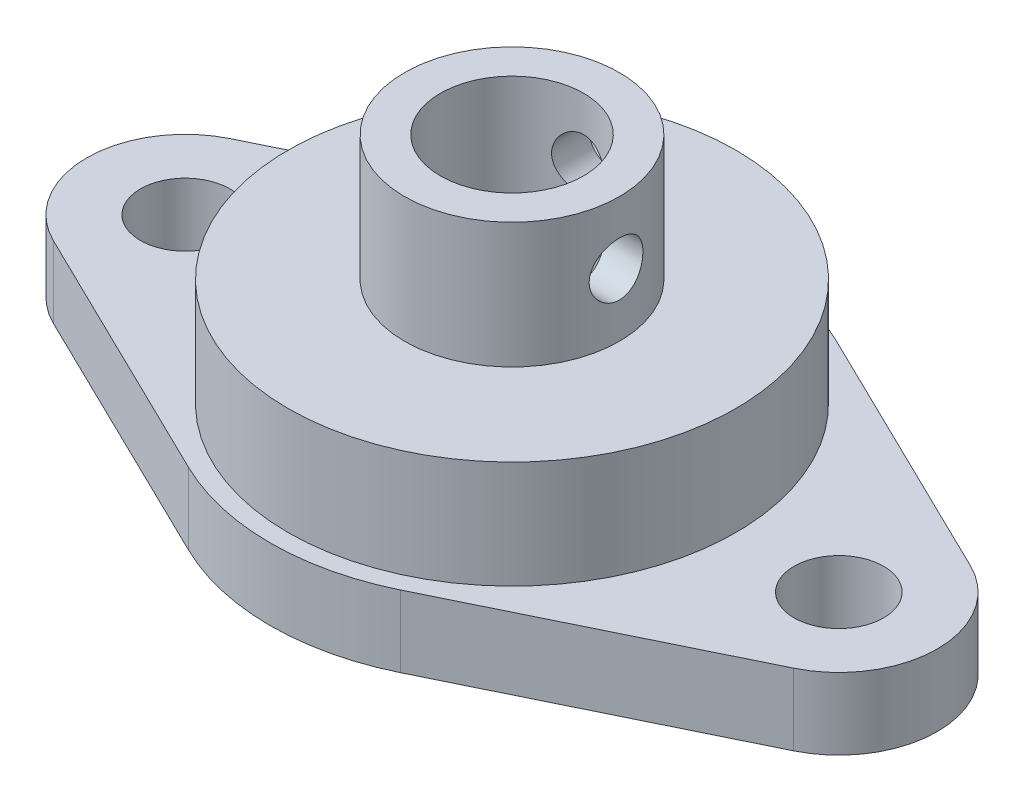
ISO-10303-21;
HEADER;
FILE_DESCRIPTION(('STEP AP214'),'2;1');
FILE_NAME('part.step','',(''),(''),'','','');
FILE_SCHEMA(('AUTOMOTIVE_DESIGN { 1 0 10303 214 1 1 1 1 }'));
ENDSEC;
DATA;
#1=APPLICATION_CONTEXT('core data for automotive mechanical design processes');
#2=APPLICATION_PROTOCOL_DEFINITION('international standard','automotive_design',2000,#1);
#3=PRODUCT_CONTEXT('',#1,'mechanical');
#4=PRODUCT('Part','Part','',(#3));
#5=PRODUCT_RELATED_PRODUCT_CATEGORY('part','',(#4));
#6=PRODUCT_DEFINITION_FORMATION('','',#4);
#7=PRODUCT_DEFINITION_CONTEXT('part definition',#1,'design');
#8=PRODUCT_DEFINITION('design','',#6,#7);
#9=PRODUCT_DEFINITION_SHAPE('','',#8);
#10=(LENGTH_UNIT() NAMED_UNIT(*) SI_UNIT(.MILLI.,.METRE.));
#11=(NAMED_UNIT(*) PLANE_ANGLE_UNIT() SI_UNIT($,.RADIAN.));
#12=(NAMED_UNIT(*) SI_UNIT($,.STERADIAN.) SOLID_ANGLE_UNIT());
#13=UNCERTAINTY_MEASURE_WITH_UNIT(LENGTH_MEASURE(1.E-05),#10,'distance_accuracy_value','');
#14=(GEOMETRIC_REPRESENTATION_CONTEXT(3) GLOBAL_UNCERTAINTY_ASSIGNED_CONTEXT((#13)) GLOBAL_UNIT_ASSIGNED_CONTEXT((#10,
#11,#12)) REPRESENTATION_CONTEXT('',''));
#15=CARTESIAN_POINT('',(0.,0.,0.));
#16=DIRECTION('',(0.,0.,1.));
#17=DIRECTION('',(1.,0.,0.));
#18=AXIS2_PLACEMENT_3D('',#15,#16,#17);
#19=CARTESIAN_POINT('',(0.,4.,0.));
#20=DIRECTION('',(0.,-1.,0.));
#21=DIRECTION('',(0.,0.,-1.));
#22=AXIS2_PLACEMENT_3D('',#19,#20,#21);
#23=CYLINDRICAL_SURFACE('',#22,4.);
#24=CARTESIAN_POINT('',(0.,17.,0.));
#25=DIRECTION('',(0.,1.,0.));
#26=DIRECTION('',(0.,0.,1.));
#27=AXIS2_PLACEMENT_3D('',#24,#25,#26);
#28=CIRCLE('',#27,4.);
#29=CARTESIAN_POINT('',(0.,17.,4.));
#30=VERTEX_POINT('',#29);
#31=EDGE_CURVE('E197',#30,#30,#28,.T.);
#32=ORIENTED_EDGE('',*,*,#31,.T.);
#33=EDGE_LOOP('',(#32));
#34=FACE_BOUND('',#33,.T.);
#35=CARTESIAN_POINT('',(0.,0.,0.));
#36=DIRECTION('',(0.,1.,0.));
#37=DIRECTION('',(0.,0.,1.));
#38=AXIS2_PLACEMENT_3D('',#35,#36,#37);
#39=CIRCLE('',#38,4.);
#40=CARTESIAN_POINT('',(0.,0.,4.));
#41=VERTEX_POINT('',#40);
#42=EDGE_CURVE('E147',#41,#41,#39,.T.);
#43=ORIENTED_EDGE('',*,*,#42,.F.);
#44=EDGE_LOOP('',(#43));
#45=FACE_BOUND('',#44,.T.);
#46=CARTESIAN_POINT('',(0.,15.,-4.));
#47=CARTESIAN_POINT('',(-0.0812350589378529,15.0000029023031,-4.00000217456151));
#48=CARTESIAN_POINT('',(-0.162450241781792,14.9933802397516,-3.99750379283184));
#49=CARTESIAN_POINT('',(-0.322453452352361,14.9671718047301,-3.98778696006928));
#50=CARTESIAN_POINT('',(-0.401241827987616,14.9475878995294,-3.98056918893993));
#51=CARTESIAN_POINT('',(-0.554060784990879,14.8962469982282,-3.96218832391545));
#52=CARTESIAN_POINT('',(-0.628100224162278,14.8645134831782,-3.9510328434944));
#53=CARTESIAN_POINT('',(-0.769799310160254,14.7898935869842,-3.92588767765353));
#54=CARTESIAN_POINT('',(-0.837457239177879,14.7470042144558,-3.91189723227548));
#55=CARTESIAN_POINT('',(-0.967346417045825,14.6493874689291,-3.88186246971217));
#56=CARTESIAN_POINT('',(-1.02927073015119,14.5942697377406,-3.86576002583566));
#57=CARTESIAN_POINT('',(-1.14324421474363,14.4745895653412,-3.83360220871327));
#58=CARTESIAN_POINT('',(-1.19529036359203,14.4100242439121,-3.81754685135033));
#59=CARTESIAN_POINT('',(-1.28998202215985,14.2702825324768,-3.78662470617731));
#60=CARTESIAN_POINT('',(-1.3321939319576,14.1947956334542,-3.77182648820818));
#61=CARTESIAN_POINT('',(-1.40318646334084,14.0371516458315,-3.74599860237433));
#62=CARTESIAN_POINT('',(-1.43197244961239,13.9549972368449,-3.73496742975881));
#63=CARTESIAN_POINT('',(-1.47408431017549,13.7898832597418,-3.71854412824136));
#64=CARTESIAN_POINT('',(-1.48799593218558,13.7070949615646,-3.71293924350838));
#65=CARTESIAN_POINT('',(-1.50179556531648,13.5401838420062,-3.70738061461215));
#66=CARTESIAN_POINT('',(-1.5016893680263,13.4560615861255,-3.70742453659305));
#67=CARTESIAN_POINT('',(-1.48790429610018,13.294230474787,-3.71297511632055));
#68=CARTESIAN_POINT('',(-1.47503808509003,13.2164390939558,-3.71815468871122));
#69=CARTESIAN_POINT('',(-1.4374416786833,13.0642128495947,-3.73284938059529));
#70=CARTESIAN_POINT('',(-1.41270969663258,12.9897784933861,-3.74236515298863));
#71=CARTESIAN_POINT('',(-1.35163748571904,12.8447229322718,-3.76485702190253));
#72=CARTESIAN_POINT('',(-1.31508648737101,12.7742005138787,-3.77789517988166));
#73=CARTESIAN_POINT('',(-1.23156073762698,12.640054262409,-3.80594210139319));
#74=CARTESIAN_POINT('',(-1.18458238728897,12.5764328224803,-3.82095154457158));
#75=CARTESIAN_POINT('',(-1.07781780766549,12.4533963363491,-3.85248038859113));
#76=CARTESIAN_POINT('',(-1.01738298716956,12.3945513592519,-3.86903347455671));
#77=CARTESIAN_POINT('',(-0.887312590819021,12.2876620337942,-3.90091728164085));
#78=CARTESIAN_POINT('',(-0.817675603497365,12.2396193453943,-3.91624781465952));
#79=CARTESIAN_POINT('',(-0.66972343699242,12.1550696029375,-3.9442639480908));
#80=CARTESIAN_POINT('',(-0.591290713844719,12.1187524187789,-3.95690498259616));
#81=CARTESIAN_POINT('',(-0.428836850524583,12.06001739573,-3.97778718326962));
#82=CARTESIAN_POINT('',(-0.344818210845767,12.0375933834389,-3.98603030341493));
#83=CARTESIAN_POINT('',(-0.178375243148665,12.0083772124581,-3.99684443228065));
#84=CARTESIAN_POINT('',(-0.0961036195622094,12.0008173936175,-3.99969369025686));
#85=CARTESIAN_POINT('',(0.0685724752550241,11.9993089361001,-4.00025893700126));
#86=CARTESIAN_POINT('',(0.150976912983372,12.0053572796832,-3.99797606386863));
#87=CARTESIAN_POINT('',(0.310262048561859,12.0303100423087,-3.98871709772643));
#88=CARTESIAN_POINT('',(0.387233328007335,12.0487115437371,-3.98192470962305));
#89=CARTESIAN_POINT('',(0.53694175495722,12.0971860725473,-3.96451477091717));
#90=CARTESIAN_POINT('',(0.609678350347534,12.127260617948,-3.9538967228203));
#91=CARTESIAN_POINT('',(0.751247765110155,12.1991864124395,-3.92949624407681));
#92=CARTESIAN_POINT('',(0.819903083557795,12.2413577292234,-3.91563000209348));
#93=CARTESIAN_POINT('',(0.949392711726625,12.3359181031716,-3.88626671564664));
#94=CARTESIAN_POINT('',(1.01022412027045,12.3883109325452,-3.87076907009516));
#95=CARTESIAN_POINT('',(1.12603079874454,12.5054041221243,-3.8387332949099));
#96=CARTESIAN_POINT('',(1.18046154123568,12.5706421827727,-3.82218696503729));
#97=CARTESIAN_POINT('',(1.27771050031903,12.7096513847077,-3.79078815746854));
#98=CARTESIAN_POINT('',(1.32052767414518,12.7834232913885,-3.77593583194399));
#99=CARTESIAN_POINT('',(1.39337773518998,12.9380159867723,-3.74966829822463));
#100=CARTESIAN_POINT('',(1.42335685446918,13.0188647459104,-3.73826760328493));
#101=CARTESIAN_POINT('',(1.46907883466889,13.1850097636878,-3.72054032891005));
#102=CARTESIAN_POINT('',(1.48483050305535,13.2703032361981,-3.71421061057491));
#103=CARTESIAN_POINT('',(1.50086347097839,13.4370161595411,-3.70775894792573));
#104=CARTESIAN_POINT('',(1.50207331495837,13.5183326317169,-3.70726444523341));
#105=CARTESIAN_POINT('',(1.49136715641593,13.6799453162762,-3.71158412745292));
#106=CARTESIAN_POINT('',(1.47945239850124,13.7602416246716,-3.71639780898899));
#107=CARTESIAN_POINT('',(1.44355815630242,13.9150472267166,-3.73048141585432));
#108=CARTESIAN_POINT('',(1.41995798316524,13.9896583462453,-3.73961085376663));
#109=CARTESIAN_POINT('',(1.3616969677992,14.1339055084944,-3.76121548297845));
#110=CARTESIAN_POINT('',(1.32703332944945,14.2035402880701,-3.77369151995215));
#111=CARTESIAN_POINT('',(1.24552075938154,14.3398267896976,-3.80139723903965));
#112=CARTESIAN_POINT('',(1.1981283280301,14.4061307967999,-3.81673698440964));
#113=CARTESIAN_POINT('',(1.09334485729906,14.5301415609712,-3.84806246757177));
#114=CARTESIAN_POINT('',(1.03595064012808,14.5878455747868,-3.86404840943145));
#115=CARTESIAN_POINT('',(0.909080396784623,14.6962019558218,-3.89590424609881));
#116=CARTESIAN_POINT('',(0.839118644212992,14.7463037534347,-3.91172104900645));
#117=CARTESIAN_POINT('',(0.691213223200821,14.8340226552766,-3.94054514457031));
#118=CARTESIAN_POINT('',(0.613268934090622,14.8716387877364,-3.95355221851559));
#119=CARTESIAN_POINT('',(0.447999082002312,14.9343768290483,-3.9757429260668));
#120=CARTESIAN_POINT('',(0.360413422234208,14.9588870646019,-3.98473657158356));
#121=CARTESIAN_POINT('',(0.181875733606382,14.9916929599207,-3.99686242179587));
#122=CARTESIAN_POINT('',(0.090925416364859,14.9999967514873,-3.99999756603967));
#123=CARTESIAN_POINT('',(0.,15.,-4.));
#124=B_SPLINE_CURVE_WITH_KNOTS('',3,(#46,#47,#48,#49,#50,#51,#52,#53,#54,#55,#56,#57,#58,#59,
#60,#61,#62,#63,#64,#65,#66,#67,#68,#69,#70,#71,#72,#73,#74,#75,#76,#77,#78,#79,#80,#81,#82,#83,
#84,#85,#86,#87,#88,#89,#90,#91,#92,#93,#94,#95,#96,#97,#98,#99,#100,#101,#102,#103,#104,#105,
#106,#107,#108,#109,#110,#111,#112,#113,#114,#115,#116,#117,#118,#119,#120,#121,#122,#123),
.UNSPECIFIED.,.T.,.F.,(4,2,2,2,2,2,2,2,2,2,2,2,2,2,2,2,2,2,2,2,2,2,2,2,2,2,2,2,2,2,2,2,2,2,2,2,
2,2,4),(0.,0.24336980156056,0.48670454953046,0.729571369213573,0.972503379609489,
1.22473618582716,1.47704604925622,1.73896674501659,2.00078269352134,2.25185874416901,
2.50283106079707,2.73878345119971,2.97477138060589,3.21522408387018,3.45575990744258,
3.71246153335813,3.96920257905066,4.22991375286075,4.49050899698846,4.73725019635925,
4.9839366839052,5.2211443792384,5.45838293254453,5.70259221859599,5.94689180019868,
6.20536519455657,6.46386178920141,6.72343066727204,6.98283874956507,7.22558763480252,
7.46831350211259,7.70363142426533,7.93900886656506,8.18672471884271,8.43451941997062,
8.69572329654039,8.95694749805102,9.22948515032042,9.50188601796127),.UNSPECIFIED.);
#125=CARTESIAN_POINT('',(0.,15.,-4.));
#126=VERTEX_POINT('',#125);
#127=EDGE_CURVE('E175',#126,#126,#124,.T.);
#128=ORIENTED_EDGE('',*,*,#127,.F.);
#129=EDGE_LOOP('',(#128));
#130=FACE_BOUND('',#129,.T.);
#131=CARTESIAN_POINT('',(3.70809924354783,13.5,1.5));
#132=CARTESIAN_POINT('',(3.70809640633806,13.4189925162792,1.50000304106109));
#133=CARTESIAN_POINT('',(3.71078260240986,13.3380050774964,1.49341597549487));
#134=CARTESIAN_POINT('',(3.72116159304967,13.1784719170868,1.46736187895468));
#135=CARTESIAN_POINT('',(3.72885423767112,13.099926122405,1.44789523373263));
#136=CARTESIAN_POINT('',(3.748254802809,12.9476246283865,1.39689657610574));
#137=CARTESIAN_POINT('',(3.7599530956926,12.8738579433489,1.36539347266349));
#138=CARTESIAN_POINT('',(3.78603134206598,12.7326281031812,1.29131856742698));
#139=CARTESIAN_POINT('',(3.80041210067323,12.6651668497175,1.24874344095039));
#140=CARTESIAN_POINT('',(3.83103574665713,12.5351096883772,1.15146661374162));
#141=CARTESIAN_POINT('',(3.84733341923603,12.4728714703706,1.09630381213307));
#142=CARTESIAN_POINT('',(3.87949750628547,12.3582771853285,0.976395839778928));
#143=CARTESIAN_POINT('',(3.89536382814785,12.3059232262581,0.911648630256681));
#144=CARTESIAN_POINT('',(3.92552873936553,12.2108604877044,0.771694655177601));
#145=CARTESIAN_POINT('',(3.93975561223505,12.1685405252841,0.696206947538029));
#146=CARTESIAN_POINT('',(3.96438007973847,12.0973488274751,0.538555771965249));
#147=CARTESIAN_POINT('',(3.97477900217006,12.068472428008,0.456394630933538));
#148=CARTESIAN_POINT('',(3.9901869710344,12.0262421042254,0.291489341676834));
#149=CARTESIAN_POINT('',(3.99540915214774,12.0122723725595,0.208923197281599));
#150=CARTESIAN_POINT('',(4.0006401410794,11.998278799055,0.0424643637947882));
#151=CARTESIAN_POINT('',(4.00065064414902,11.9982504223813,-0.0414278850628309));
#152=CARTESIAN_POINT('',(3.99559265903894,12.0117817614652,-0.203743543064474));
#153=CARTESIAN_POINT('',(3.99077541996683,12.0246692979488,-0.282232178266898));
#154=CARTESIAN_POINT('',(3.97693274932263,12.0625359152256,-0.435839217984389));
#155=CARTESIAN_POINT('',(3.96790701975578,12.087515852262,-0.510957383430296));
#156=CARTESIAN_POINT('',(3.94637769167531,12.1491704516758,-0.656989017303102));
#157=CARTESIAN_POINT('',(3.93382539470077,12.1860100052684,-0.727825392287307));
#158=CARTESIAN_POINT('',(3.90651310225279,12.2701920969294,-0.862486607957557));
#159=CARTESIAN_POINT('',(3.8917523951284,12.3175380230176,-0.926309176932321));
#160=CARTESIAN_POINT('',(3.86052529655816,12.4246272862832,-1.04909048680093));
#161=CARTESIAN_POINT('',(3.84400963763883,12.4849339156504,-1.10754614526348));
#162=CARTESIAN_POINT('',(3.81182460645722,12.6145929933216,-1.21370395569342));
#163=CARTESIAN_POINT('',(3.79615544748847,12.6839477065866,-1.261403406929));
#164=CARTESIAN_POINT('',(3.76712703500335,12.8317194674628,-1.34565611808151));
#165=CARTESIAN_POINT('',(3.75382677150277,12.9103034936861,-1.38193847851831));
#166=CARTESIAN_POINT('',(3.73172438629003,13.0730962251676,-1.44056464441501));
#167=CARTESIAN_POINT('',(3.72291976205783,13.1573017715937,-1.46291620605595));
#168=CARTESIAN_POINT('',(3.71139597222848,13.323975962316,-1.49190191709668));
#169=CARTESIAN_POINT('',(3.70836785241537,13.4062841055361,-1.49933521158966));
#170=CARTESIAN_POINT('',(3.70786539525016,13.5710093567417,-1.50057885636272));
#171=CARTESIAN_POINT('',(3.71038967003987,13.6534264323525,-1.49439261093762));
#172=CARTESIAN_POINT('',(3.72039381629735,13.8119299222877,-1.46929733520157));
#173=CARTESIAN_POINT('',(3.72763276216449,13.8881311357647,-1.45100618334224));
#174=CARTESIAN_POINT('',(3.74596487046362,14.0363479447202,-1.40299774640637));
#175=CARTESIAN_POINT('',(3.75705882250173,14.1083626791681,-1.37327812034623));
#176=CARTESIAN_POINT('',(3.7823624311608,14.2491644380762,-1.30200292275278));
#177=CARTESIAN_POINT('',(3.79667328892065,14.3177292921373,-1.26004545177047));
#178=CARTESIAN_POINT('',(3.82662814294291,14.447128981726,-1.16591317862479));
#179=CARTESIAN_POINT('',(3.84227262594077,14.5079609746246,-1.11373463696434));
#180=CARTESIAN_POINT('',(3.87433046553184,14.6241683731951,-0.996727340900936));
#181=CARTESIAN_POINT('',(3.89072969357028,14.6789534087688,-0.93130634149106));
#182=CARTESIAN_POINT('',(3.92149874963302,14.7768383675894,-0.791797471753149));
#183=CARTESIAN_POINT('',(3.93586857107664,14.8199382529458,-0.717709573322671));
#184=CARTESIAN_POINT('',(3.96094985704552,14.8929460561996,-0.563016329468475));
#185=CARTESIAN_POINT('',(3.9716738133801,14.9228991237926,-0.482434433064625));
#186=CARTESIAN_POINT('',(3.98829436712571,14.9686564138499,-0.316881887523253));
#187=CARTESIAN_POINT('',(3.99419323299413,14.9844672854224,-0.231913320723591));
#188=CARTESIAN_POINT('',(4.00028407317073,15.0007744027548,-0.0653355852738141));
#189=CARTESIAN_POINT('',(4.00078860953764,15.002109483059,0.0161807680608466));
#190=CARTESIAN_POINT('',(3.99684889809223,14.9915848405546,0.178226786412425));
#191=CARTESIAN_POINT('',(3.9924052471313,14.9797267091141,0.258756569245258));
#192=CARTESIAN_POINT('',(3.97921089603771,14.9437411485064,0.414548248377127));
#193=CARTESIAN_POINT('',(3.97056791378017,14.9199200941216,0.489890731068835));
#194=CARTESIAN_POINT('',(3.9498778362099,14.8609899866156,0.635515473006391));
#195=CARTESIAN_POINT('',(3.93783009655664,14.8258787966952,0.705796771275544));
#196=CARTESIAN_POINT('',(3.91090618300074,14.7436860564952,0.842540176994414));
#197=CARTESIAN_POINT('',(3.89593240108828,14.6961633594859,0.90871754884685));
#198=CARTESIAN_POINT('',(3.86499507694844,14.5911921698124,1.03241734752336));
#199=CARTESIAN_POINT('',(3.84903118274027,14.5337401341921,1.0899366712559));
#200=CARTESIAN_POINT('',(3.81688129739175,14.4069358683549,1.19781214236196));
#201=CARTESIAN_POINT('',(3.8007280534916,14.3371155978457,1.24762999816025));
#202=CARTESIAN_POINT('',(3.77098325003638,14.1895841304267,1.33484709556843));
#203=CARTESIAN_POINT('',(3.75739195631216,14.1118721159465,1.37224504878157));
#204=CARTESIAN_POINT('',(3.73402269853266,13.9470443190246,1.4346588697426));
#205=CARTESIAN_POINT('',(3.7244380329086,13.8596656334882,1.45906002899523));
#206=CARTESIAN_POINT('',(3.71147994336315,13.6815147280442,1.49172356722079));
#207=CARTESIAN_POINT('',(3.70810242179736,13.59074478729,1.49999659339571));
#208=CARTESIAN_POINT('',(3.70809924354783,13.5,1.5));
#209=B_SPLINE_CURVE_WITH_KNOTS('',3,(#131,#132,#133,#134,#135,#136,#137,#138,#139,#140,#141,
#142,#143,#144,#145,#146,#147,#148,#149,#150,#151,#152,#153,#154,#155,#156,#157,#158,#159,#160,
#161,#162,#163,#164,#165,#166,#167,#168,#169,#170,#171,#172,#173,#174,#175,#176,#177,#178,#179,
#180,#181,#182,#183,#184,#185,#186,#187,#188,#189,#190,#191,#192,#193,#194,#195,#196,#197,#198,
#199,#200,#201,#202,#203,#204,#205,#206,#207,#208),.UNSPECIFIED.,.T.,.F.,(4,2,2,2,2,2,2,2,2,2,2,
2,2,2,2,2,2,2,2,2,2,2,2,2,2,2,2,2,2,2,2,2,2,2,2,2,2,2,4),(0.,0.242684541416169,
0.485361814598854,0.72745985675703,0.969630679682932,1.22274652401128,1.47591628822983,
1.73770072136421,1.9993942638133,2.24980018489679,2.50012465404857,2.73806472803194,
2.97602165263335,3.21744131210668,3.45893893628976,3.71456675065874,3.97025867827335,
4.23162592252966,4.49284751635474,4.73965657740485,4.98640395388884,5.22143845928198,
5.45652113429526,5.70041561005822,5.94439948466355,6.20385016993624,6.46330169650178,
6.72185508890168,6.98028685560127,7.22365720549936,7.4669982031948,7.7044027400389,
7.94185223512831,8.18928323676987,8.43680270894964,8.69738599542079,8.95799630544242,
9.23003178870926,9.50188762323053),.UNSPECIFIED.);
#210=CARTESIAN_POINT('',(3.70809924354783,13.5,1.5));
#211=VERTEX_POINT('',#210);
#212=EDGE_CURVE('E176',#211,#211,#209,.T.);
#213=ORIENTED_EDGE('',*,*,#212,.T.);
#214=EDGE_LOOP('',(#213));
#215=FACE_BOUND('',#214,.T.);
#216=ADVANCED_FACE('F38',(#34,#45,#130,#215),#23,.F.);
#217=CARTESIAN_POINT('',(0.,17.,0.));
#218=DIRECTION('',(0.,-1.,0.));
#219=DIRECTION('',(0.,0.,-1.));
#220=AXIS2_PLACEMENT_3D('',#217,#218,#219);
#221=CYLINDRICAL_SURFACE('',#220,6.);
#222=CARTESIAN_POINT('',(0.,15.,-6.));
#223=CARTESIAN_POINT('',(-0.0828760886697309,14.9999976742618,-5.99999859868013));
#224=CARTESIAN_POINT('',(-0.165778157830763,14.9931084492262,-5.99826578131828));
#225=CARTESIAN_POINT('',(-0.329206323770532,14.965774848693,-5.99152113829892));
#226=CARTESIAN_POINT('',(-0.409731046870739,14.9453227904622,-5.98650745419968));
#227=CARTESIAN_POINT('',(-0.566020872182577,14.8915607465379,-5.9737562633204));
#228=CARTESIAN_POINT('',(-0.641791563430003,14.8582662012847,-5.96602202842087));
#229=CARTESIAN_POINT('',(-0.786672131904426,14.7798186099552,-5.94865343807593));
#230=CARTESIAN_POINT('',(-0.855781784348759,14.7346651638811,-5.9390190185405));
#231=CARTESIAN_POINT('',(-0.986801927300919,14.6327992103458,-5.91867413591801));
#232=CARTESIAN_POINT('',(-1.04855569006107,14.5758884250408,-5.90794707148533));
#233=CARTESIAN_POINT('',(-1.1617489272033,14.4525477950911,-5.8867362011753));
#234=CARTESIAN_POINT('',(-1.21318723694913,14.3861168770535,-5.87625242288348));
#235=CARTESIAN_POINT('',(-1.30502654279903,14.2444047732626,-5.8565477569971));
#236=CARTESIAN_POINT('',(-1.34525221592536,14.1690067691896,-5.84734794470605));
#237=CARTESIAN_POINT('',(-1.41239690855053,14.0122515883416,-5.83149494812223));
#238=CARTESIAN_POINT('',(-1.43931805543933,13.9308953666742,-5.82484135672789));
#239=CARTESIAN_POINT('',(-1.47855483680429,13.7662565017975,-5.81500476717551));
#240=CARTESIAN_POINT('',(-1.49115226833334,13.6830451039502,-5.81175491075426));
#241=CARTESIAN_POINT('',(-1.50226177506785,13.515631430986,-5.80889362537741));
#242=CARTESIAN_POINT('',(-1.50077614181798,13.4314293193014,-5.80928160448644));
#243=CARTESIAN_POINT('',(-1.48398652463928,13.2665841922555,-5.81359205496618));
#244=CARTESIAN_POINT('',(-1.46901834019052,13.1859043785349,-5.81742863001879));
#245=CARTESIAN_POINT('',(-1.42622418690311,13.0282389490887,-5.82806709676484));
#246=CARTESIAN_POINT('',(-1.39839730206942,12.951253596971,-5.83486919970696));
#247=CARTESIAN_POINT('',(-1.33038947793716,12.8022619837479,-5.85075113904187));
#248=CARTESIAN_POINT('',(-1.29008666723291,12.7303138282104,-5.85985327469421));
#249=CARTESIAN_POINT('',(-1.19835627601496,12.5940812902432,-5.87929710846386));
#250=CARTESIAN_POINT('',(-1.14692674880884,12.5297982519327,-5.88963902334735));
#251=CARTESIAN_POINT('',(-1.03266342468122,12.4087963843056,-5.91075880539781));
#252=CARTESIAN_POINT('',(-0.969546258165859,12.3523455099386,-5.92154069477971));
#253=CARTESIAN_POINT('',(-0.8346119175037,12.2507787575361,-5.94205965578786));
#254=CARTESIAN_POINT('',(-0.762794477707944,12.2056632257364,-5.95179669549415));
#255=CARTESIAN_POINT('',(-0.612115888681392,12.1279494137756,-5.96917732094183));
#256=CARTESIAN_POINT('',(-0.533231393208624,12.0953946597456,-5.97681360127725));
#257=CARTESIAN_POINT('',(-0.370876008142883,12.0440826942904,-5.98907916991419));
#258=CARTESIAN_POINT('',(-0.287405999150485,12.0253228435819,-5.99370903339281));
#259=CARTESIAN_POINT('',(-0.120539970390027,12.0025424344412,-5.99935499271375));
#260=CARTESIAN_POINT('',(-0.0371967199882098,11.9981569739247,-6.00046053508279));
#261=CARTESIAN_POINT('',(0.129032874801508,12.0032490020555,-5.99918804814451));
#262=CARTESIAN_POINT('',(0.211919259644595,12.0127252427991,-5.99681033241847));
#263=CARTESIAN_POINT('',(0.373614268776491,12.0449709083914,-5.98889581127357));
#264=CARTESIAN_POINT('',(0.452465118968754,12.067541263477,-5.98340634185811));
#265=CARTESIAN_POINT('',(0.605257292452511,12.1251070840284,-5.96988706634134));
#266=CARTESIAN_POINT('',(0.679198119032634,12.1601038043132,-5.96185700369892));
#267=CARTESIAN_POINT('',(0.821523134429847,12.2422361288747,-5.94393307926311));
#268=CARTESIAN_POINT('',(0.88978544183583,12.2895761123968,-5.93400867366932));
#269=CARTESIAN_POINT('',(1.01752661364325,12.394789908797,-5.91344509187419));
#270=CARTESIAN_POINT('',(1.07700395897301,12.4526655396169,-5.90280579251705));
#271=CARTESIAN_POINT('',(1.18699056807273,12.5790019608445,-5.88168956960771));
#272=CARTESIAN_POINT('',(1.23724386762203,12.6476877030024,-5.87122304187281));
#273=CARTESIAN_POINT('',(1.3255107590127,12.7927326344657,-5.85192878377239));
#274=CARTESIAN_POINT('',(1.36352489415794,12.8690914829598,-5.84310098067026));
#275=CARTESIAN_POINT('',(1.42595142060929,13.0269057224131,-5.82818094734665));
#276=CARTESIAN_POINT('',(1.45044439665406,13.108327628344,-5.82207255291906));
#277=CARTESIAN_POINT('',(1.48534565995378,13.2743096378891,-5.81326744090184));
#278=CARTESIAN_POINT('',(1.49575702747866,13.3588690510325,-5.81056997719936));
#279=CARTESIAN_POINT('',(1.50203859033399,13.5261210238552,-5.80894901203957));
#280=CARTESIAN_POINT('',(1.49831789778012,13.6087974351247,-5.80991932728264));
#281=CARTESIAN_POINT('',(1.47737727831287,13.772303888668,-5.81527909007843));
#282=CARTESIAN_POINT('',(1.46015762268677,13.8531339680136,-5.81966846891857));
#283=CARTESIAN_POINT('',(1.41293131944279,14.0102084590654,-5.83131260682723));
#284=CARTESIAN_POINT('',(1.38300140468038,14.0864773052402,-5.83855015236309));
#285=CARTESIAN_POINT('',(1.31126491360507,14.2329653827137,-5.85507755724829));
#286=CARTESIAN_POINT('',(1.26945669003419,14.3031837731869,-5.86436770120773));
#287=CARTESIAN_POINT('',(1.17386774863714,14.437554629002,-5.88425634263512));
#288=CARTESIAN_POINT('',(1.11980316291226,14.501501073424,-5.89488264831757));
#289=CARTESIAN_POINT('',(1.00178937118974,14.6195470447954,-5.91608027246286));
#290=CARTESIAN_POINT('',(0.937837821261146,14.673644230113,-5.9266515772706));
#291=CARTESIAN_POINT('',(0.80046758670259,14.7714113085646,-5.94677655647663));
#292=CARTESIAN_POINT('',(0.726898422316387,14.8148746136716,-5.95630833365868));
#293=CARTESIAN_POINT('',(0.573266059510476,14.8887474629405,-5.97304924975118));
#294=CARTESIAN_POINT('',(0.49320756343674,14.9191663606485,-5.98026005199781));
#295=CARTESIAN_POINT('',(0.344410253243473,14.9615718303297,-5.99048059565542));
#296=CARTESIAN_POINT('',(0.27638017090807,14.9759512430534,-5.99402585052691));
#297=CARTESIAN_POINT('',(0.138906071536284,14.9951659436219,-5.99878605231948));
#298=CARTESIAN_POINT('',(0.0694621612426167,15.0000019493053,-6.00000117450894));
#299=CARTESIAN_POINT('',(0.,15.,-6.));
#300=B_SPLINE_CURVE_WITH_KNOTS('',3,(#222,#223,#224,#225,#226,#227,#228,#229,#230,#231,#232,
#233,#234,#235,#236,#237,#238,#239,#240,#241,#242,#243,#244,#245,#246,#247,#248,#249,#250,#251,
#252,#253,#254,#255,#256,#257,#258,#259,#260,#261,#262,#263,#264,#265,#266,#267,#268,#269,#270,
#271,#272,#273,#274,#275,#276,#277,#278,#279,#280,#281,#282,#283,#284,#285,#286,#287,#288,#289,
#290,#291,#292,#293,#294,#295,#296,#297,#298,#299),.UNSPECIFIED.,.T.,.F.,(4,2,2,2,2,2,2,2,2,2,2,
2,2,2,2,2,2,2,2,2,2,2,2,2,2,2,2,2,2,2,2,2,2,2,2,2,2,2,4),(0.,0.248373712471889,
0.496888237763899,0.745104902286106,0.993329940169327,1.24614435437139,1.49898729580062,
1.75558647545807,2.01214461169368,2.2635629509943,2.51494038112697,2.76022497007018,
3.00552703466038,3.25330527873879,3.50112690836163,3.75601500969019,4.01091089558247,
4.26668229009114,4.52240473688643,4.77158308949276,5.02073901112743,5.26620274514037,
5.5116912732229,5.76153587565352,6.01142363008019,6.26744509204476,6.52345518749508,
6.77792254614036,7.03233423252407,7.27943780398612,7.52653640956034,7.77216400559447,
8.01782568136901,8.2698957640991,8.52202569770417,8.77872185499588,9.0352336382135,
9.24342242942149,9.45159556043039),.UNSPECIFIED.);
#301=CARTESIAN_POINT('',(0.,15.,-6.));
#302=VERTEX_POINT('',#301);
#303=EDGE_CURVE('E169',#302,#302,#300,.T.);
#304=ORIENTED_EDGE('',*,*,#303,.T.);
#305=EDGE_LOOP('',(#304));
#306=FACE_BOUND('',#305,.T.);
#307=CARTESIAN_POINT('',(0.,17.,0.));
#308=DIRECTION('',(0.,1.,0.));
#309=DIRECTION('',(0.,0.,1.));
#310=AXIS2_PLACEMENT_3D('',#307,#308,#309);
#311=CIRCLE('',#310,6.);
#312=CARTESIAN_POINT('',(0.,17.,6.));
#313=VERTEX_POINT('',#312);
#314=EDGE_CURVE('E277',#313,#313,#311,.T.);
#315=ORIENTED_EDGE('',*,*,#314,.F.);
#316=EDGE_LOOP('',(#315));
#317=FACE_BOUND('',#316,.T.);
#318=CARTESIAN_POINT('',(0.,10.,0.));
#319=DIRECTION('',(0.,1.,0.));
#320=DIRECTION('',(0.,0.,1.));
#321=AXIS2_PLACEMENT_3D('',#318,#319,#320);
#322=CIRCLE('',#321,6.);
#323=CARTESIAN_POINT('',(0.,10.,6.));
#324=VERTEX_POINT('',#323);
#325=EDGE_CURVE('E280',#324,#324,#322,.T.);
#326=ORIENTED_EDGE('',*,*,#325,.T.);
#327=EDGE_LOOP('',(#326));
#328=FACE_BOUND('',#327,.T.);
#329=CARTESIAN_POINT('',(5.80947501931113,13.5,1.5));
#330=CARTESIAN_POINT('',(5.80947660051185,13.4171695494452,1.49999764715507));
#331=CARTESIAN_POINT('',(5.81126583608348,13.3343130607932,1.49311574729838));
#332=CARTESIAN_POINT('',(5.81821117195949,13.1709794530956,1.46581387527849));
#333=CARTESIAN_POINT('',(5.82336923173088,13.090503747319,1.44538602404532));
#334=CARTESIAN_POINT('',(5.8364323475758,12.9343178770878,1.39169471977917));
#335=CARTESIAN_POINT('',(5.84433385614245,12.8586017067686,1.35844783671268));
#336=CARTESIAN_POINT('',(5.86198915217285,12.713813488476,1.28011268475685));
#337=CARTESIAN_POINT('',(5.87174301827101,12.6447417227519,1.23502391313642));
#338=CARTESIAN_POINT('',(5.89224429813367,12.5136830128427,1.13322505638713));
#339=CARTESIAN_POINT('',(5.90300758573818,12.45186383979,1.07630213262243));
#340=CARTESIAN_POINT('',(5.92417725309178,12.3385431633838,0.952909238460401));
#341=CARTESIAN_POINT('',(5.93458359939834,12.287042624627,0.886438376508187));
#342=CARTESIAN_POINT('',(5.95404249312349,12.1951347194212,0.744687120647377));
#343=CARTESIAN_POINT('',(5.96307412440355,12.1548921671031,0.669296745717076));
#344=CARTESIAN_POINT('',(5.9785848715559,12.0877142135081,0.512557910575661));
#345=CARTESIAN_POINT('',(5.98506436400607,12.0607768488507,0.431210331475168));
#346=CARTESIAN_POINT('',(5.99462855308908,12.0215112992529,0.266615255252501));
#347=CARTESIAN_POINT('',(5.99777936306589,12.0088982134041,0.18343963172939));
#348=CARTESIAN_POINT('',(6.00056156464379,11.9977449724347,0.0160972915576659));
#349=CARTESIAN_POINT('',(6.00019347658022,11.9992027366742,-0.0680692767228369));
#350=CARTESIAN_POINT('',(5.99602856972121,12.0159449101501,-0.233028370758577));
#351=CARTESIAN_POINT('',(5.99230801404524,12.0309217950323,-0.313854323401596));
#352=CARTESIAN_POINT('',(5.98194501914912,12.0737827620291,-0.471807371120525));
#353=CARTESIAN_POINT('',(5.97530242439065,12.1016675312264,-0.548934269055653));
#354=CARTESIAN_POINT('',(5.95972505820537,12.1698015424122,-0.698110055252706));
#355=CARTESIAN_POINT('',(5.95077011817032,12.210160226797,-0.770106764649752));
#356=CARTESIAN_POINT('',(5.9315394228579,12.3020134074698,-0.906413433510729));
#357=CARTESIAN_POINT('',(5.92126343791494,12.3535098411364,-0.970722052628254));
#358=CARTESIAN_POINT('',(5.90018228261712,12.4678252451894,-1.09166105262743));
#359=CARTESIAN_POINT('',(5.88937031715551,12.5309129354087,-1.14803651861279));
#360=CARTESIAN_POINT('',(5.86869026110024,12.6657599841241,-1.24946456394452));
#361=CARTESIAN_POINT('',(5.85882221463583,12.7375197476946,-1.29451661406902));
#362=CARTESIAN_POINT('',(5.84112298098989,12.8881740204894,-1.37218219353389));
#363=CARTESIAN_POINT('',(5.83330190235433,12.9671014381879,-1.40473435045573));
#364=CARTESIAN_POINT('',(5.82071184083974,13.1295512808459,-1.45602843095451));
#365=CARTESIAN_POINT('',(5.81594220486131,13.2130727183899,-1.47477330982936));
#366=CARTESIAN_POINT('',(5.81013213623485,13.3799757009139,-1.4974977831991));
#367=CARTESIAN_POINT('',(5.80899653456189,13.4633026759978,-1.50185428435177));
#368=CARTESIAN_POINT('',(5.81032406088624,13.6294931619469,-1.49671019430933));
#369=CARTESIAN_POINT('',(5.8127868576076,13.7123567147707,-1.48721087870928));
#370=CARTESIAN_POINT('',(5.82094249172736,13.8738685589728,-1.45495527836259));
#371=CARTESIAN_POINT('',(5.82658182140625,13.9525636359425,-1.43241844096904));
#372=CARTESIAN_POINT('',(5.84040430962578,14.105058874711,-1.37497084900237));
#373=CARTESIAN_POINT('',(5.84858776949168,14.1788584554332,-1.34005862862752));
#374=CARTESIAN_POINT('',(5.86677682255958,14.3210647667204,-1.25806240076193));
#375=CARTESIAN_POINT('',(5.87681501163985,14.3893373040259,-1.21075305230138));
#376=CARTESIAN_POINT('',(5.8975024984303,14.5171130176808,-1.10559043940168));
#377=CARTESIAN_POINT('',(5.90815189637082,14.57661474999,-1.04773544220816));
#378=CARTESIAN_POINT('',(5.92918441818964,14.6866866255426,-0.921394081477087));
#379=CARTESIAN_POINT('',(5.93955421237101,14.7369960375293,-0.852677928797387));
#380=CARTESIAN_POINT('',(5.95858329968241,14.8253615201707,-0.707554024042011));
#381=CARTESIAN_POINT('',(5.96724268202376,14.8634182299649,-0.631146673436384));
#382=CARTESIAN_POINT('',(5.98182069442989,14.9258676207168,-0.473337302596633));
#383=CARTESIAN_POINT('',(5.98775898013446,14.9503585706274,-0.39197607154182));
#384=CARTESIAN_POINT('',(5.99631176037473,14.985276200765,-0.22612464047821));
#385=CARTESIAN_POINT('',(5.99892689636045,14.9957055952434,-0.141635047561864));
#386=CARTESIAN_POINT('',(6.00051254113217,15.0020513843633,0.0256252896649906));
#387=CARTESIAN_POINT('',(5.99957968320012,14.9983525636431,0.108380740449051));
#388=CARTESIAN_POINT('',(5.99438844686135,14.9774282590585,0.27205124462211));
#389=CARTESIAN_POINT('',(5.99013016735643,14.9602031774803,0.352966352671331));
#390=CARTESIAN_POINT('',(5.97878149280944,14.9129216703436,0.510256553467225));
#391=CARTESIAN_POINT('',(5.97170646753999,14.8829348200281,0.586653741871529));
#392=CARTESIAN_POINT('',(5.95546933370076,14.811044131471,0.733375579562204));
#393=CARTESIAN_POINT('',(5.94630696206604,14.7691387909957,0.803699461897578));
#394=CARTESIAN_POINT('',(5.92660874521999,14.6734271490044,0.938102892635851));
#395=CARTESIAN_POINT('',(5.91604525418417,14.6193597856389,1.00199248245088));
#396=CARTESIAN_POINT('',(5.89485973579863,14.5013657220393,1.11992253040688));
#397=CARTESIAN_POINT('',(5.88423769428834,14.4374365258531,1.17396048760229));
#398=CARTESIAN_POINT('',(5.86391213790822,14.300097878698,1.27164303971884));
#399=CARTESIAN_POINT('',(5.85422945594827,14.2265338148811,1.31507492916983));
#400=CARTESIAN_POINT('',(5.83715933325924,14.0729167651159,1.3888903449235));
#401=CARTESIAN_POINT('',(5.82977022370054,13.9928685508399,1.41928336463958));
#402=CARTESIAN_POINT('',(5.81927863109675,13.8441344822599,1.46163379284816));
#403=CARTESIAN_POINT('',(5.8156299450082,13.7761602534242,1.47598975589307));
#404=CARTESIAN_POINT('',(5.81072757878358,13.6387966965001,1.49517343885991));
#405=CARTESIAN_POINT('',(5.80947369434945,13.5694074896324,1.50000197155828));
#406=CARTESIAN_POINT('',(5.80947501931113,13.5,1.5));
#407=B_SPLINE_CURVE_WITH_KNOTS('',3,(#329,#330,#331,#332,#333,#334,#335,#336,#337,#338,#339,
#340,#341,#342,#343,#344,#345,#346,#347,#348,#349,#350,#351,#352,#353,#354,#355,#356,#357,#358,
#359,#360,#361,#362,#363,#364,#365,#366,#367,#368,#369,#370,#371,#372,#373,#374,#375,#376,#377,
#378,#379,#380,#381,#382,#383,#384,#385,#386,#387,#388,#389,#390,#391,#392,#393,#394,#395,#396,
#397,#398,#399,#400,#401,#402,#403,#404,#405,#406),.UNSPECIFIED.,.T.,.F.,(4,2,2,2,2,2,2,2,2,2,2,
2,2,2,2,2,2,2,2,2,2,2,2,2,2,2,2,2,2,2,2,2,2,2,2,2,2,2,4),(0.,0.24823646504168,0.496617444857199,
0.744678436299613,0.992749960532872,1.24574372515786,1.4987611288792,1.75530897838752,
2.01181895908255,2.26313250597208,2.51440889199612,2.76010957613368,3.00582334034871,
3.25375724552666,3.50173431281348,3.75642279943147,4.01112318719881,4.26705859205041,
4.52293920077728,4.7720614485703,5.02116076310281,5.26618443005524,5.5112371285285,
5.76109707515494,6.01099811331027,6.26715198579191,6.52329249431732,6.77755243684157,
7.03176329345423,7.27910067676474,7.52643070426188,7.77242925935826,8.01845883442843,
8.27038257949242,8.52237018939305,8.77905886370806,9.03556032819972,9.24358696306398,
9.45159585059712),.UNSPECIFIED.);
#408=CARTESIAN_POINT('',(5.80947501931113,13.5,1.5));
#409=VERTEX_POINT('',#408);
#410=EDGE_CURVE('E42',#409,#409,#407,.T.);
#411=ORIENTED_EDGE('',*,*,#410,.F.);
#412=EDGE_LOOP('',(#411));
#413=FACE_BOUND('',#412,.T.);
#414=ADVANCED_FACE('F177',(#306,#317,#328,#413),#221,.T.);
#415=CARTESIAN_POINT('',(0.,10.,0.));
#416=DIRECTION('',(0.,1.,0.));
#417=DIRECTION('',(0.,0.,1.));
#418=AXIS2_PLACEMENT_3D('',#415,#416,#417);
#419=PLANE('',#418);
#420=CARTESIAN_POINT('',(0.,10.,0.));
#421=DIRECTION('',(0.,1.,0.));
#422=DIRECTION('',(0.,0.,1.));
#423=AXIS2_PLACEMENT_3D('',#420,#421,#422);
#424=CIRCLE('',#423,12.5);
#425=CARTESIAN_POINT('',(0.,10.,12.5));
#426=VERTEX_POINT('',#425);
#427=EDGE_CURVE('E271',#426,#426,#424,.T.);
#428=ORIENTED_EDGE('',*,*,#427,.T.);
#429=EDGE_LOOP('',(#428));
#430=FACE_BOUND('',#429,.T.);
#431=ORIENTED_EDGE('',*,*,#325,.F.);
#432=EDGE_LOOP('',(#431));
#433=FACE_BOUND('',#432,.T.);
#434=ADVANCED_FACE('F213',(#430,#433),#419,.T.);
#435=CARTESIAN_POINT('',(-18.25,4.,0.));
#436=DIRECTION('',(0.,1.,0.));
#437=DIRECTION('',(0.,0.,1.));
#438=AXIS2_PLACEMENT_3D('',#435,#436,#437);
#439=PLANE('',#438);
#440=CARTESIAN_POINT('',(-18.25,4.,0.));
#441=DIRECTION('',(0.,1.,0.));
#442=DIRECTION('',(0.,0.,-1.));
#443=AXIS2_PLACEMENT_3D('',#440,#441,#442);
#444=CIRCLE('',#443,2.5);
#445=CARTESIAN_POINT('',(-18.25,4.,-2.5));
#446=VERTEX_POINT('',#445);
#447=EDGE_CURVE('E265',#446,#446,#444,.T.);
#448=ORIENTED_EDGE('',*,*,#447,.F.);
#449=EDGE_LOOP('',(#448));
#450=FACE_BOUND('',#449,.T.);
#451=CARTESIAN_POINT('',(-18.25,4.,0.));
#452=DIRECTION('',(0.,1.,0.));
#453=DIRECTION('',(0.,0.,1.));
#454=AXIS2_PLACEMENT_3D('',#451,#452,#453);
#455=CIRCLE('',#454,5.5);
#456=CARTESIAN_POINT('',(-20.6609589041096,4.,-4.94340744453607));
#457=VERTEX_POINT('',#456);
#458=CARTESIAN_POINT('',(-20.6609589041096,4.,4.94340744453607));
#459=VERTEX_POINT('',#458);
#460=EDGE_CURVE('E158',#457,#459,#455,.T.);
#461=ORIENTED_EDGE('',*,*,#460,.T.);
#462=DIRECTION('',(0.898801353552014,0.,0.438356164383562));
#463=VECTOR('',#462,1.);
#464=CARTESIAN_POINT('',(-20.6609589041096,4.,4.94340744453607));
#465=LINE('',#464,#463);
#466=CARTESIAN_POINT('',(-5.91780821917809,4.,12.1338182729522));
#467=VERTEX_POINT('',#466);
#468=EDGE_CURVE('E105',#459,#467,#465,.T.);
#469=ORIENTED_EDGE('',*,*,#468,.T.);
#470=CARTESIAN_POINT('',(0.,4.,0.));
#471=DIRECTION('',(0.,1.,0.));
#472=DIRECTION('',(0.,0.,1.));
#473=AXIS2_PLACEMENT_3D('',#470,#471,#472);
#474=CIRCLE('',#473,13.5);
#475=CARTESIAN_POINT('',(5.91780821917808,4.,12.1338182729522));
#476=VERTEX_POINT('',#475);
#477=EDGE_CURVE('E247',#467,#476,#474,.T.);
#478=ORIENTED_EDGE('',*,*,#477,.T.);
#479=DIRECTION('',(0.898801353552014,0.,-0.438356164383562));
#480=VECTOR('',#479,1.);
#481=CARTESIAN_POINT('',(20.6609589041096,4.,4.94340744453607));
#482=LINE('',#481,#480);
#483=CARTESIAN_POINT('',(20.6609589041096,4.,4.94340744453607));
#484=VERTEX_POINT('',#483);
#485=EDGE_CURVE('E253',#476,#484,#482,.T.);
#486=ORIENTED_EDGE('',*,*,#485,.T.);
#487=CARTESIAN_POINT('',(18.25,4.,0.));
#488=DIRECTION('',(0.,1.,0.));
#489=DIRECTION('',(0.,0.,1.));
#490=AXIS2_PLACEMENT_3D('',#487,#488,#489);
#491=CIRCLE('',#490,5.5);
#492=CARTESIAN_POINT('',(20.6609589041096,4.,-4.94340744453607));
#493=VERTEX_POINT('',#492);
#494=EDGE_CURVE('E125',#484,#493,#491,.T.);
#495=ORIENTED_EDGE('',*,*,#494,.T.);
#496=DIRECTION('',(-0.898801353552014,0.,-0.438356164383562));
#497=VECTOR('',#496,1.);
#498=CARTESIAN_POINT('',(20.6609589041096,4.,-4.94340744453607));
#499=LINE('',#498,#497);
#500=CARTESIAN_POINT('',(5.91780821917808,4.,-12.1338182729522));
#501=VERTEX_POINT('',#500);
#502=EDGE_CURVE('E118',#493,#501,#499,.T.);
#503=ORIENTED_EDGE('',*,*,#502,.T.);
#504=CARTESIAN_POINT('',(0.,4.,0.));
#505=DIRECTION('',(0.,1.,0.));
#506=DIRECTION('',(0.,0.,1.));
#507=AXIS2_PLACEMENT_3D('',#504,#505,#506);
#508=CIRCLE('',#507,13.5);
#509=CARTESIAN_POINT('',(-5.91780821917808,4.,-12.1338182729522));
#510=VERTEX_POINT('',#509);
#511=EDGE_CURVE('E123',#501,#510,#508,.T.);
#512=ORIENTED_EDGE('',*,*,#511,.T.);
#513=DIRECTION('',(-0.898801353552014,0.,0.438356164383562));
#514=VECTOR('',#513,1.);
#515=CARTESIAN_POINT('',(-20.6609589041096,4.,-4.94340744453607));
#516=LINE('',#515,#514);
#517=EDGE_CURVE('E62',#510,#457,#516,.T.);
#518=ORIENTED_EDGE('',*,*,#517,.T.);
#519=EDGE_LOOP('',(#461,#469,#478,#486,#495,#503,#512,#518));
#520=FACE_BOUND('',#519,.T.);
#521=CARTESIAN_POINT('',(18.25,4.,0.));
#522=DIRECTION('',(0.,1.,0.));
#523=DIRECTION('',(0.,0.,1.));
#524=AXIS2_PLACEMENT_3D('',#521,#522,#523);
#525=CIRCLE('',#524,2.5);
#526=CARTESIAN_POINT('',(18.25,4.,2.5));
#527=VERTEX_POINT('',#526);
#528=EDGE_CURVE('E261',#527,#527,#525,.T.);
#529=ORIENTED_EDGE('',*,*,#528,.F.);
#530=EDGE_LOOP('',(#529));
#531=FACE_BOUND('',#530,.T.);
#532=CARTESIAN_POINT('',(0.,4.,0.));
#533=DIRECTION('',(0.,1.,0.));
#534=DIRECTION('',(0.,0.,1.));
#535=AXIS2_PLACEMENT_3D('',#532,#533,#534);
#536=CIRCLE('',#535,12.5);
#537=CARTESIAN_POINT('',(0.,4.,12.5));
#538=VERTEX_POINT('',#537);
#539=EDGE_CURVE('E274',#538,#538,#536,.T.);
#540=ORIENTED_EDGE('',*,*,#539,.F.);
#541=EDGE_LOOP('',(#540));
#542=FACE_BOUND('',#541,.T.);
#543=ADVANCED_FACE('F120',(#450,#520,#531,#542),#439,.T.);
#544=CARTESIAN_POINT('',(-18.25,0.,0.));
#545=DIRECTION('',(0.,1.,0.));
#546=DIRECTION('',(0.,0.,1.));
#547=AXIS2_PLACEMENT_3D('',#544,#545,#546);
#548=PLANE('',#547);
#549=CARTESIAN_POINT('',(-18.25,0.,0.));
#550=DIRECTION('',(0.,1.,0.));
#551=DIRECTION('',(0.,0.,1.));
#552=AXIS2_PLACEMENT_3D('',#549,#550,#551);
#553=CIRCLE('',#552,5.5);
#554=CARTESIAN_POINT('',(-20.6609589041096,0.,-4.94340744453607));
#555=VERTEX_POINT('',#554);
#556=CARTESIAN_POINT('',(-20.6609589041096,0.,4.94340744453607));
#557=VERTEX_POINT('',#556);
#558=EDGE_CURVE('E143',#555,#557,#553,.T.);
#559=ORIENTED_EDGE('',*,*,#558,.F.);
#560=DIRECTION('',(-0.898801353552014,0.,0.438356164383562));
#561=VECTOR('',#560,1.);
#562=CARTESIAN_POINT('',(-20.6609589041096,0.,-4.94340744453607));
#563=LINE('',#562,#561);
#564=CARTESIAN_POINT('',(-5.91780821917808,0.,-12.1338182729522));
#565=VERTEX_POINT('',#564);
#566=EDGE_CURVE('E97',#565,#555,#563,.T.);
#567=ORIENTED_EDGE('',*,*,#566,.F.);
#568=CARTESIAN_POINT('',(0.,0.,0.));
#569=DIRECTION('',(0.,1.,0.));
#570=DIRECTION('',(0.,0.,1.));
#571=AXIS2_PLACEMENT_3D('',#568,#569,#570);
#572=CIRCLE('',#571,13.5);
#573=CARTESIAN_POINT('',(5.91780821917808,0.,-12.1338182729522));
#574=VERTEX_POINT('',#573);
#575=EDGE_CURVE('E91',#574,#565,#572,.T.);
#576=ORIENTED_EDGE('',*,*,#575,.F.);
#577=DIRECTION('',(-0.898801353552014,0.,-0.438356164383562));
#578=VECTOR('',#577,1.);
#579=CARTESIAN_POINT('',(20.6609589041096,0.,-4.94340744453607));
#580=LINE('',#579,#578);
#581=CARTESIAN_POINT('',(20.6609589041096,0.,-4.94340744453607));
#582=VERTEX_POINT('',#581);
#583=EDGE_CURVE('E133',#582,#574,#580,.T.);
#584=ORIENTED_EDGE('',*,*,#583,.F.);
#585=CARTESIAN_POINT('',(18.25,0.,0.));
#586=DIRECTION('',(0.,1.,0.));
#587=DIRECTION('',(0.,0.,1.));
#588=AXIS2_PLACEMENT_3D('',#585,#586,#587);
#589=CIRCLE('',#588,5.5);
#590=CARTESIAN_POINT('',(20.6609589041096,0.,4.94340744453607));
#591=VERTEX_POINT('',#590);
#592=EDGE_CURVE('E153',#591,#582,#589,.T.);
#593=ORIENTED_EDGE('',*,*,#592,.F.);
#594=DIRECTION('',(0.898801353552014,0.,-0.438356164383562));
#595=VECTOR('',#594,1.);
#596=CARTESIAN_POINT('',(20.6609589041096,0.,4.94340744453607));
#597=LINE('',#596,#595);
#598=CARTESIAN_POINT('',(5.91780821917808,0.,12.1338182729522));
#599=VERTEX_POINT('',#598);
#600=EDGE_CURVE('E151',#599,#591,#597,.T.);
#601=ORIENTED_EDGE('',*,*,#600,.F.);
#602=CARTESIAN_POINT('',(0.,0.,0.));
#603=DIRECTION('',(0.,1.,0.));
#604=DIRECTION('',(0.,0.,1.));
#605=AXIS2_PLACEMENT_3D('',#602,#603,#604);
#606=CIRCLE('',#605,13.5);
#607=CARTESIAN_POINT('',(-5.91780821917809,0.,12.1338182729522));
#608=VERTEX_POINT('',#607);
#609=EDGE_CURVE('E149',#608,#599,#606,.T.);
#610=ORIENTED_EDGE('',*,*,#609,.F.);
#611=DIRECTION('',(0.898801353552014,0.,0.438356164383562));
#612=VECTOR('',#611,1.);
#613=CARTESIAN_POINT('',(-20.6609589041096,0.,4.94340744453607));
#614=LINE('',#613,#612);
#615=EDGE_CURVE('E146',#557,#608,#614,.T.);
#616=ORIENTED_EDGE('',*,*,#615,.F.);
#617=EDGE_LOOP('',(#559,#567,#576,#584,#593,#601,#610,#616));
#618=FACE_BOUND('',#617,.T.);
#619=ORIENTED_EDGE('',*,*,#42,.T.);
#620=EDGE_LOOP('',(#619));
#621=FACE_BOUND('',#620,.T.);
#622=CARTESIAN_POINT('',(18.25,0.,0.));
#623=DIRECTION('',(0.,1.,0.));
#624=DIRECTION('',(0.,0.,1.));
#625=AXIS2_PLACEMENT_3D('',#622,#623,#624);
#626=CIRCLE('',#625,2.5);
#627=CARTESIAN_POINT('',(18.25,0.,2.5));
#628=VERTEX_POINT('',#627);
#629=EDGE_CURVE('E262',#628,#628,#626,.T.);
#630=ORIENTED_EDGE('',*,*,#629,.T.);
#631=EDGE_LOOP('',(#630));
#632=FACE_BOUND('',#631,.T.);
#633=CARTESIAN_POINT('',(-18.25,0.,0.));
#634=DIRECTION('',(0.,1.,0.));
#635=DIRECTION('',(0.,0.,-1.));
#636=AXIS2_PLACEMENT_3D('',#633,#634,#635);
#637=CIRCLE('',#636,2.5);
#638=CARTESIAN_POINT('',(-18.25,0.,-2.5));
#639=VERTEX_POINT('',#638);
#640=EDGE_CURVE('E268',#639,#639,#637,.T.);
#641=ORIENTED_EDGE('',*,*,#640,.T.);
#642=EDGE_LOOP('',(#641));
#643=FACE_BOUND('',#642,.T.);
#644=ADVANCED_FACE('F212',(#618,#621,#632,#643),#548,.F.);
#645=CARTESIAN_POINT('',(-18.25,4.,0.));
#646=DIRECTION('',(0.,-1.,0.));
#647=DIRECTION('',(0.,0.,-1.));
#648=AXIS2_PLACEMENT_3D('',#645,#646,#647);
#649=CYLINDRICAL_SURFACE('',#648,5.5);
#650=ORIENTED_EDGE('',*,*,#558,.T.);
#651=DIRECTION('',(0.,-1.,0.));
#652=VECTOR('',#651,1.);
#653=CARTESIAN_POINT('',(-20.6609589041096,4.,4.94340744453607));
#654=LINE('',#653,#652);
#655=EDGE_CURVE('E11',#459,#557,#654,.T.);
#656=ORIENTED_EDGE('',*,*,#655,.F.);
#657=ORIENTED_EDGE('',*,*,#460,.F.);
#658=DIRECTION('',(0.,-1.,0.));
#659=VECTOR('',#658,1.);
#660=CARTESIAN_POINT('',(-20.6609589041096,4.,-4.94340744453607));
#661=LINE('',#660,#659);
#662=EDGE_CURVE('E139',#457,#555,#661,.T.);
#663=ORIENTED_EDGE('',*,*,#662,.T.);
#664=EDGE_LOOP('',(#650,#656,#657,#663));
#665=FACE_BOUND('',#664,.T.);
#666=ADVANCED_FACE('F40',(#665),#649,.T.);
#667=CARTESIAN_POINT('',(-20.6609589041096,4.,4.94340744453607));
#668=DIRECTION('',(0.438356164383562,0.,-0.898801353552014));
#669=DIRECTION('',(-0.898801353552014,0.,-0.438356164383562));
#670=AXIS2_PLACEMENT_3D('',#667,#668,#669);
#671=PLANE('',#670);
#672=ORIENTED_EDGE('',*,*,#615,.T.);
#673=DIRECTION('',(0.,-1.,0.));
#674=VECTOR('',#673,1.);
#675=CARTESIAN_POINT('',(-5.91780821917809,4.,12.1338182729522));
#676=LINE('',#675,#674);
#677=EDGE_CURVE('E53',#467,#608,#676,.T.);
#678=ORIENTED_EDGE('',*,*,#677,.F.);
#679=ORIENTED_EDGE('',*,*,#468,.F.);
#680=ORIENTED_EDGE('',*,*,#655,.T.);
#681=EDGE_LOOP('',(#672,#678,#679,#680));
#682=FACE_BOUND('',#681,.T.);
#683=ADVANCED_FACE('F235',(#682),#671,.F.);
#684=CARTESIAN_POINT('',(0.,4.,0.));
#685=DIRECTION('',(0.,-1.,0.));
#686=DIRECTION('',(0.,0.,-1.));
#687=AXIS2_PLACEMENT_3D('',#684,#685,#686);
#688=CYLINDRICAL_SURFACE('',#687,13.5);
#689=ORIENTED_EDGE('',*,*,#609,.T.);
#690=DIRECTION('',(0.,-1.,0.));
#691=VECTOR('',#690,1.);
#692=CARTESIAN_POINT('',(5.91780821917808,4.,12.1338182729522));
#693=LINE('',#692,#691);
#694=EDGE_CURVE('E165',#476,#599,#693,.T.);
#695=ORIENTED_EDGE('',*,*,#694,.F.);
#696=ORIENTED_EDGE('',*,*,#477,.F.);
#697=ORIENTED_EDGE('',*,*,#677,.T.);
#698=EDGE_LOOP('',(#689,#695,#696,#697));
#699=FACE_BOUND('',#698,.T.);
#700=ADVANCED_FACE('F232',(#699),#688,.T.);
#701=CARTESIAN_POINT('',(20.6609589041096,4.,4.94340744453607));
#702=DIRECTION('',(-0.438356164383562,0.,-0.898801353552014));
#703=DIRECTION('',(-0.898801353552014,0.,0.438356164383562));
#704=AXIS2_PLACEMENT_3D('',#701,#702,#703);
#705=PLANE('',#704);
#706=ORIENTED_EDGE('',*,*,#600,.T.);
#707=DIRECTION('',(0.,-1.,0.));
#708=VECTOR('',#707,1.);
#709=CARTESIAN_POINT('',(20.6609589041096,4.,4.94340744453607));
#710=LINE('',#709,#708);
#711=EDGE_CURVE('E162',#484,#591,#710,.T.);
#712=ORIENTED_EDGE('',*,*,#711,.F.);
#713=ORIENTED_EDGE('',*,*,#485,.F.);
#714=ORIENTED_EDGE('',*,*,#694,.T.);
#715=EDGE_LOOP('',(#706,#712,#713,#714));
#716=FACE_BOUND('',#715,.T.);
#717=ADVANCED_FACE('F228',(#716),#705,.F.);
#718=CARTESIAN_POINT('',(18.25,4.,0.));
#719=DIRECTION('',(0.,-1.,0.));
#720=DIRECTION('',(0.,0.,-1.));
#721=AXIS2_PLACEMENT_3D('',#718,#719,#720);
#722=CYLINDRICAL_SURFACE('',#721,5.5);
#723=ORIENTED_EDGE('',*,*,#592,.T.);
#724=DIRECTION('',(0.,-1.,0.));
#725=VECTOR('',#724,1.);
#726=CARTESIAN_POINT('',(20.6609589041096,4.,-4.94340744453607));
#727=LINE('',#726,#725);
#728=EDGE_CURVE('E134',#493,#582,#727,.T.);
#729=ORIENTED_EDGE('',*,*,#728,.F.);
#730=ORIENTED_EDGE('',*,*,#494,.F.);
#731=ORIENTED_EDGE('',*,*,#711,.T.);
#732=EDGE_LOOP('',(#723,#729,#730,#731));
#733=FACE_BOUND('',#732,.T.);
#734=ADVANCED_FACE('F225',(#733),#722,.T.);
#735=CARTESIAN_POINT('',(20.6609589041096,4.,-4.94340744453607));
#736=DIRECTION('',(-0.438356164383562,0.,0.898801353552014));
#737=DIRECTION('',(0.898801353552014,0.,0.438356164383562));
#738=AXIS2_PLACEMENT_3D('',#735,#736,#737);
#739=PLANE('',#738);
#740=ORIENTED_EDGE('',*,*,#583,.T.);
#741=DIRECTION('',(0.,-1.,0.));
#742=VECTOR('',#741,1.);
#743=CARTESIAN_POINT('',(5.91780821917808,4.,-12.1338182729522));
#744=LINE('',#743,#742);
#745=EDGE_CURVE('E130',#501,#574,#744,.T.);
#746=ORIENTED_EDGE('',*,*,#745,.F.);
#747=ORIENTED_EDGE('',*,*,#502,.F.);
#748=ORIENTED_EDGE('',*,*,#728,.T.);
#749=EDGE_LOOP('',(#740,#746,#747,#748));
#750=FACE_BOUND('',#749,.T.);
#751=ADVANCED_FACE('F131',(#750),#739,.F.);
#752=CARTESIAN_POINT('',(0.,4.,0.));
#753=DIRECTION('',(0.,-1.,0.));
#754=DIRECTION('',(0.,0.,-1.));
#755=AXIS2_PLACEMENT_3D('',#752,#753,#754);
#756=CYLINDRICAL_SURFACE('',#755,13.5);
#757=ORIENTED_EDGE('',*,*,#575,.T.);
#758=DIRECTION('',(0.,-1.,0.));
#759=VECTOR('',#758,1.);
#760=CARTESIAN_POINT('',(-5.91780821917808,4.,-12.1338182729522));
#761=LINE('',#760,#759);
#762=EDGE_CURVE('E135',#510,#565,#761,.T.);
#763=ORIENTED_EDGE('',*,*,#762,.F.);
#764=ORIENTED_EDGE('',*,*,#511,.F.);
#765=ORIENTED_EDGE('',*,*,#745,.T.);
#766=EDGE_LOOP('',(#757,#763,#764,#765));
#767=FACE_BOUND('',#766,.T.);
#768=ADVANCED_FACE('F137',(#767),#756,.T.);
#769=CARTESIAN_POINT('',(-20.6609589041096,4.,-4.94340744453607));
#770=DIRECTION('',(0.438356164383562,0.,0.898801353552014));
#771=DIRECTION('',(0.898801353552014,0.,-0.438356164383562));
#772=AXIS2_PLACEMENT_3D('',#769,#770,#771);
#773=PLANE('',#772);
#774=ORIENTED_EDGE('',*,*,#566,.T.);
#775=ORIENTED_EDGE('',*,*,#662,.F.);
#776=ORIENTED_EDGE('',*,*,#517,.F.);
#777=ORIENTED_EDGE('',*,*,#762,.T.);
#778=EDGE_LOOP('',(#774,#775,#776,#777));
#779=FACE_BOUND('',#778,.T.);
#780=ADVANCED_FACE('F218',(#779),#773,.F.);
#781=CARTESIAN_POINT('',(18.25,4.,0.));
#782=DIRECTION('',(0.,-1.,0.));
#783=DIRECTION('',(0.,0.,-1.));
#784=AXIS2_PLACEMENT_3D('',#781,#782,#783);
#785=CYLINDRICAL_SURFACE('',#784,2.5);
#786=ORIENTED_EDGE('',*,*,#528,.T.);
#787=EDGE_LOOP('',(#786));
#788=FACE_BOUND('',#787,.T.);
#789=ORIENTED_EDGE('',*,*,#629,.F.);
#790=EDGE_LOOP('',(#789));
#791=FACE_BOUND('',#790,.T.);
#792=ADVANCED_FACE('F207',(#788,#791),#785,.F.);
#793=CARTESIAN_POINT('',(-18.25,4.,0.));
#794=DIRECTION('',(0.,-1.,0.));
#795=DIRECTION('',(0.,0.,-1.));
#796=AXIS2_PLACEMENT_3D('',#793,#794,#795);
#797=CYLINDRICAL_SURFACE('',#796,2.5);
#798=ORIENTED_EDGE('',*,*,#447,.T.);
#799=EDGE_LOOP('',(#798));
#800=FACE_BOUND('',#799,.T.);
#801=ORIENTED_EDGE('',*,*,#640,.F.);
#802=EDGE_LOOP('',(#801));
#803=FACE_BOUND('',#802,.T.);
#804=ADVANCED_FACE('F321',(#800,#803),#797,.F.);
#805=CARTESIAN_POINT('',(0.,10.,0.));
#806=DIRECTION('',(0.,-1.,0.));
#807=DIRECTION('',(0.,0.,-1.));
#808=AXIS2_PLACEMENT_3D('',#805,#806,#807);
#809=CYLINDRICAL_SURFACE('',#808,12.5);
#810=ORIENTED_EDGE('',*,*,#427,.F.);
#811=EDGE_LOOP('',(#810));
#812=FACE_BOUND('',#811,.T.);
#813=ORIENTED_EDGE('',*,*,#539,.T.);
#814=EDGE_LOOP('',(#813));
#815=FACE_BOUND('',#814,.T.);
#816=ADVANCED_FACE('F314',(#812,#815),#809,.T.);
#817=CARTESIAN_POINT('',(0.,17.,0.));
#818=DIRECTION('',(0.,1.,0.));
#819=DIRECTION('',(0.,0.,1.));
#820=AXIS2_PLACEMENT_3D('',#817,#818,#819);
#821=PLANE('',#820);
#822=ORIENTED_EDGE('',*,*,#314,.T.);
#823=EDGE_LOOP('',(#822));
#824=FACE_BOUND('',#823,.T.);
#825=ORIENTED_EDGE('',*,*,#31,.F.);
#826=EDGE_LOOP('',(#825));
#827=FACE_BOUND('',#826,.T.);
#828=ADVANCED_FACE('F185',(#824,#827),#821,.T.);
#829=CARTESIAN_POINT('',(0.,13.5,-13.5));
#830=DIRECTION('',(0.,0.,1.));
#831=DIRECTION('',(1.,0.,0.));
#832=AXIS2_PLACEMENT_3D('',#829,#830,#831);
#833=CYLINDRICAL_SURFACE('',#832,1.5);
#834=ORIENTED_EDGE('',*,*,#127,.T.);
#835=EDGE_LOOP('',(#834));
#836=FACE_BOUND('',#835,.T.);
#837=ORIENTED_EDGE('',*,*,#303,.F.);
#838=EDGE_LOOP('',(#837));
#839=FACE_BOUND('',#838,.T.);
#840=ADVANCED_FACE('F181',(#836,#839),#833,.F.);
#841=CARTESIAN_POINT('',(23.75,13.5,0.));
#842=DIRECTION('',(-1.,0.,0.));
#843=DIRECTION('',(0.,0.,1.));
#844=AXIS2_PLACEMENT_3D('',#841,#842,#843);
#845=CYLINDRICAL_SURFACE('',#844,1.5);
#846=ORIENTED_EDGE('',*,*,#212,.F.);
#847=EDGE_LOOP('',(#846));
#848=FACE_BOUND('',#847,.T.);
#849=ORIENTED_EDGE('',*,*,#410,.T.);
#850=EDGE_LOOP('',(#849));
#851=FACE_BOUND('',#850,.T.);
#852=ADVANCED_FACE('F184',(#848,#851),#845,.F.);
#853=CLOSED_SHELL('',(#216,#414,#434,#543,#644,#666,#683,#700,#717,#734,#751,#768,#780,#792,
#804,#816,#828,#840,#852));
#854=MANIFOLD_SOLID_BREP('B2',#853);
#855=ADVANCED_BREP_SHAPE_REPRESENTATION('',(#18,#854),#14);
#856=SHAPE_DEFINITION_REPRESENTATION(#9,#855);
ENDSEC;
END-ISO-10303-21;
